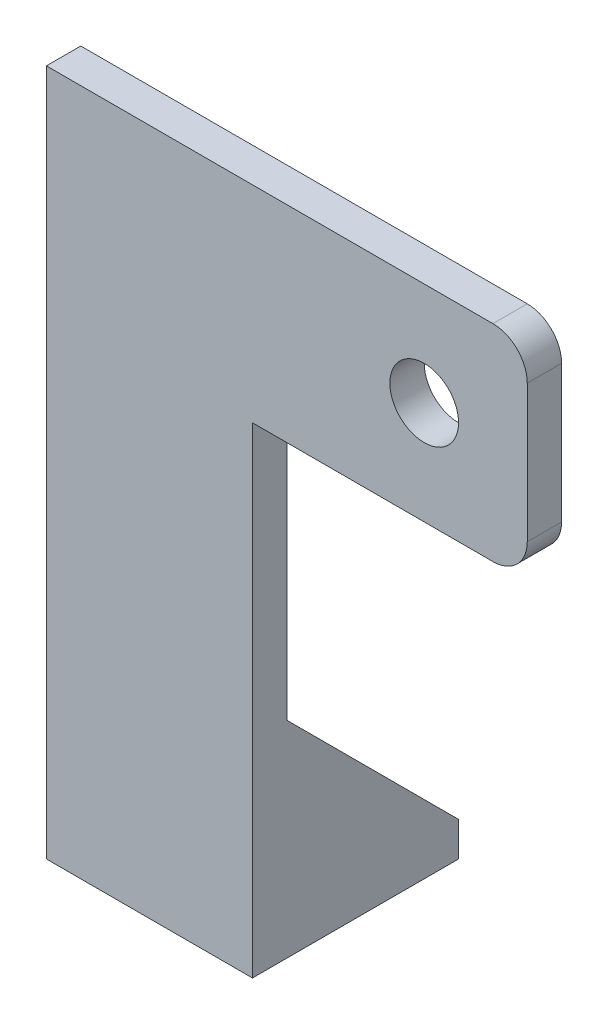
ISO-10303-21;
HEADER;
FILE_DESCRIPTION(('STEP AP214'),'2;1');
FILE_NAME('part.step','',(''),(''),'','','');
FILE_SCHEMA(('AUTOMOTIVE_DESIGN { 1 0 10303 214 1 1 1 1 }'));
ENDSEC;
DATA;
#1=APPLICATION_CONTEXT('core data for automotive mechanical design processes');
#2=APPLICATION_PROTOCOL_DEFINITION('international standard','automotive_design',2000,#1);
#3=PRODUCT_CONTEXT('',#1,'mechanical');
#4=PRODUCT('Part','Part','',(#3));
#5=PRODUCT_RELATED_PRODUCT_CATEGORY('part','',(#4));
#6=PRODUCT_DEFINITION_FORMATION('','',#4);
#7=PRODUCT_DEFINITION_CONTEXT('part definition',#1,'design');
#8=PRODUCT_DEFINITION('design','',#6,#7);
#9=PRODUCT_DEFINITION_SHAPE('','',#8);
#10=(LENGTH_UNIT() NAMED_UNIT(*) SI_UNIT(.MILLI.,.METRE.));
#11=(NAMED_UNIT(*) PLANE_ANGLE_UNIT() SI_UNIT($,.RADIAN.));
#12=(NAMED_UNIT(*) SI_UNIT($,.STERADIAN.) SOLID_ANGLE_UNIT());
#13=UNCERTAINTY_MEASURE_WITH_UNIT(LENGTH_MEASURE(1.E-05),#10,'distance_accuracy_value','');
#14=(GEOMETRIC_REPRESENTATION_CONTEXT(3) GLOBAL_UNCERTAINTY_ASSIGNED_CONTEXT((#13)) GLOBAL_UNIT_ASSIGNED_CONTEXT((#10,
#11,#12)) REPRESENTATION_CONTEXT('',''));
#15=CARTESIAN_POINT('',(0.,0.,0.));
#16=DIRECTION('',(0.,0.,1.));
#17=DIRECTION('',(1.,0.,0.));
#18=AXIS2_PLACEMENT_3D('',#15,#16,#17);
#19=CARTESIAN_POINT('',(0.,-95.,0.));
#20=DIRECTION('',(0.,-1.,0.));
#21=DIRECTION('',(0.,0.,-1.));
#22=AXIS2_PLACEMENT_3D('',#19,#20,#21);
#23=PLANE('',#22);
#24=DIRECTION('',(0.,0.,-1.));
#25=VECTOR('',#24,1.);
#26=CARTESIAN_POINT('',(45.,-95.,0.));
#27=LINE('',#26,#25);
#28=CARTESIAN_POINT('',(45.,-95.,0.));
#29=VERTEX_POINT('',#28);
#30=CARTESIAN_POINT('',(45.,-95.,-25.));
#31=VERTEX_POINT('',#30);
#32=EDGE_CURVE('E204',#29,#31,#27,.T.);
#33=ORIENTED_EDGE('',*,*,#32,.F.);
#34=DIRECTION('',(-1.,0.,0.));
#35=VECTOR('',#34,1.);
#36=CARTESIAN_POINT('',(70.,-95.,0.));
#37=LINE('',#36,#35);
#38=CARTESIAN_POINT('',(65.,-95.,0.));
#39=VERTEX_POINT('',#38);
#40=EDGE_CURVE('E143',#39,#29,#37,.T.);
#41=ORIENTED_EDGE('',*,*,#40,.F.);
#42=DIRECTION('',(0.,0.,-1.));
#43=VECTOR('',#42,1.);
#44=CARTESIAN_POINT('',(65.,-95.,0.));
#45=LINE('',#44,#43);
#46=CARTESIAN_POINT('',(65.,-95.,-25.));
#47=VERTEX_POINT('',#46);
#48=EDGE_CURVE('E198',#39,#47,#45,.T.);
#49=ORIENTED_EDGE('',*,*,#48,.T.);
#50=DIRECTION('',(1.,0.,0.));
#51=VECTOR('',#50,1.);
#52=CARTESIAN_POINT('',(40.,-95.,-25.));
#53=LINE('',#52,#51);
#54=EDGE_CURVE('E175',#31,#47,#53,.T.);
#55=ORIENTED_EDGE('',*,*,#54,.F.);
#56=EDGE_LOOP('',(#33,#41,#49,#55));
#57=FACE_BOUND('',#56,.T.);
#58=ADVANCED_FACE('F36',(#57),#23,.F.);
#59=CARTESIAN_POINT('',(5.,-5.,0.));
#60=DIRECTION('',(0.,0.,1.));
#61=DIRECTION('',(1.,0.,0.));
#62=AXIS2_PLACEMENT_3D('',#59,#60,#61);
#63=PLANE('',#62);
#64=CARTESIAN_POINT('',(95.,-15.,0.));
#65=DIRECTION('',(0.,0.,-1.));
#66=DIRECTION('',(-1.,0.,0.));
#67=AXIS2_PLACEMENT_3D('',#64,#65,#66);
#68=CIRCLE('',#67,5.);
#69=CARTESIAN_POINT('',(90.,-15.,0.));
#70=VERTEX_POINT('',#69);
#71=EDGE_CURVE('E152',#70,#70,#68,.T.);
#72=ORIENTED_EDGE('',*,*,#71,.F.);
#73=EDGE_LOOP('',(#72));
#74=FACE_BOUND('',#73,.T.);
#75=DIRECTION('',(0.,-1.,0.));
#76=VECTOR('',#75,1.);
#77=CARTESIAN_POINT('',(40.,-30.,0.));
#78=LINE('',#77,#76);
#79=CARTESIAN_POINT('',(40.,0.,0.));
#80=VERTEX_POINT('',#79);
#81=CARTESIAN_POINT('',(40.,-70.,0.));
#82=VERTEX_POINT('',#81);
#83=EDGE_CURVE('E132',#80,#82,#78,.T.);
#84=ORIENTED_EDGE('',*,*,#83,.F.);
#85=DIRECTION('',(1.,0.,0.));
#86=VECTOR('',#85,1.);
#87=CARTESIAN_POINT('',(5.,0.,0.));
#88=LINE('',#87,#86);
#89=CARTESIAN_POINT('',(105.,0.,0.));
#90=VERTEX_POINT('',#89);
#91=EDGE_CURVE('E137',#80,#90,#88,.T.);
#92=ORIENTED_EDGE('',*,*,#91,.T.);
#93=CARTESIAN_POINT('',(105.,-5.00000000000001,0.));
#94=DIRECTION('',(0.,0.,-1.));
#95=DIRECTION('',(-1.,0.,0.));
#96=AXIS2_PLACEMENT_3D('',#93,#94,#95);
#97=CIRCLE('',#96,5.);
#98=CARTESIAN_POINT('',(110.,-5.00000000000001,0.));
#99=VERTEX_POINT('',#98);
#100=EDGE_CURVE('E229',#90,#99,#97,.T.);
#101=ORIENTED_EDGE('',*,*,#100,.T.);
#102=DIRECTION('',(0.,-1.,0.));
#103=VECTOR('',#102,1.);
#104=CARTESIAN_POINT('',(110.,-5.00000000000001,0.));
#105=LINE('',#104,#103);
#106=CARTESIAN_POINT('',(110.,-25.,0.));
#107=VERTEX_POINT('',#106);
#108=EDGE_CURVE('E221',#99,#107,#105,.T.);
#109=ORIENTED_EDGE('',*,*,#108,.T.);
#110=CARTESIAN_POINT('',(105.,-25.,0.));
#111=DIRECTION('',(0.,0.,1.));
#112=DIRECTION('',(1.,0.,0.));
#113=AXIS2_PLACEMENT_3D('',#110,#111,#112);
#114=CIRCLE('',#113,5.);
#115=CARTESIAN_POINT('',(105.,-30.,0.));
#116=VERTEX_POINT('',#115);
#117=EDGE_CURVE('E225',#116,#107,#114,.T.);
#118=ORIENTED_EDGE('',*,*,#117,.F.);
#119=DIRECTION('',(-1.,0.,0.));
#120=VECTOR('',#119,1.);
#121=CARTESIAN_POINT('',(105.,-30.,0.));
#122=LINE('',#121,#120);
#123=CARTESIAN_POINT('',(70.,-30.,0.));
#124=VERTEX_POINT('',#123);
#125=EDGE_CURVE('E53',#116,#124,#122,.T.);
#126=ORIENTED_EDGE('',*,*,#125,.T.);
#127=DIRECTION('',(0.,-1.,0.));
#128=VECTOR('',#127,1.);
#129=CARTESIAN_POINT('',(70.,0.,0.));
#130=LINE('',#129,#128);
#131=CARTESIAN_POINT('',(70.,-70.,0.));
#132=VERTEX_POINT('',#131);
#133=EDGE_CURVE('E158',#124,#132,#130,.T.);
#134=ORIENTED_EDGE('',*,*,#133,.T.);
#135=DIRECTION('',(1.,0.,0.));
#136=VECTOR('',#135,1.);
#137=CARTESIAN_POINT('',(65.,-70.,0.));
#138=LINE('',#137,#136);
#139=CARTESIAN_POINT('',(65.,-70.,0.));
#140=VERTEX_POINT('',#139);
#141=EDGE_CURVE('E188',#140,#132,#138,.T.);
#142=ORIENTED_EDGE('',*,*,#141,.F.);
#143=DIRECTION('',(0.,-1.,0.));
#144=VECTOR('',#143,1.);
#145=CARTESIAN_POINT('',(65.,-70.,0.));
#146=LINE('',#145,#144);
#147=EDGE_CURVE('E195',#140,#39,#146,.T.);
#148=ORIENTED_EDGE('',*,*,#147,.T.);
#149=ORIENTED_EDGE('',*,*,#40,.T.);
#150=DIRECTION('',(0.,-1.,0.));
#151=VECTOR('',#150,1.);
#152=CARTESIAN_POINT('',(45.,-70.,0.));
#153=LINE('',#152,#151);
#154=CARTESIAN_POINT('',(45.,-70.,0.));
#155=VERTEX_POINT('',#154);
#156=EDGE_CURVE('E207',#155,#29,#153,.T.);
#157=ORIENTED_EDGE('',*,*,#156,.F.);
#158=DIRECTION('',(-1.,0.,0.));
#159=VECTOR('',#158,1.);
#160=CARTESIAN_POINT('',(45.,-70.,0.));
#161=LINE('',#160,#159);
#162=EDGE_CURVE('E140',#155,#82,#161,.T.);
#163=ORIENTED_EDGE('',*,*,#162,.T.);
#164=EDGE_LOOP('',(#84,#92,#101,#109,#118,#126,#134,#142,#148,#149,#157,#163));
#165=FACE_BOUND('',#164,.T.);
#166=ADVANCED_FACE('F134',(#74,#165),#63,.F.);
#167=CARTESIAN_POINT('',(40.,-30.,5.));
#168=DIRECTION('',(1.,0.,0.));
#169=DIRECTION('',(0.,1.,0.));
#170=AXIS2_PLACEMENT_3D('',#167,#168,#169);
#171=PLANE('',#170);
#172=DIRECTION('',(0.,0.,-1.));
#173=VECTOR('',#172,1.);
#174=CARTESIAN_POINT('',(40.,-100.,5.));
#175=LINE('',#174,#173);
#176=CARTESIAN_POINT('',(40.,-100.,5.));
#177=VERTEX_POINT('',#176);
#178=CARTESIAN_POINT('',(40.,-100.,-25.));
#179=VERTEX_POINT('',#178);
#180=EDGE_CURVE('E174',#177,#179,#175,.T.);
#181=ORIENTED_EDGE('',*,*,#180,.F.);
#182=DIRECTION('',(0.,-1.,0.));
#183=VECTOR('',#182,1.);
#184=CARTESIAN_POINT('',(40.,-30.,5.));
#185=LINE('',#184,#183);
#186=CARTESIAN_POINT('',(40.,0.,5.));
#187=VERTEX_POINT('',#186);
#188=EDGE_CURVE('E149',#187,#177,#185,.T.);
#189=ORIENTED_EDGE('',*,*,#188,.F.);
#190=DIRECTION('',(0.,0.,-1.));
#191=VECTOR('',#190,1.);
#192=CARTESIAN_POINT('',(40.,0.,5.));
#193=LINE('',#192,#191);
#194=EDGE_CURVE('E147',#187,#80,#193,.T.);
#195=ORIENTED_EDGE('',*,*,#194,.T.);
#196=ORIENTED_EDGE('',*,*,#83,.T.);
#197=DIRECTION('',(0.,0.707106781186547,0.707106781186548));
#198=VECTOR('',#197,1.);
#199=CARTESIAN_POINT('',(40.,-70.,0.));
#200=LINE('',#199,#198);
#201=CARTESIAN_POINT('',(40.,-95.,-25.));
#202=VERTEX_POINT('',#201);
#203=EDGE_CURVE('E205',#202,#82,#200,.T.);
#204=ORIENTED_EDGE('',*,*,#203,.F.);
#205=DIRECTION('',(0.,1.,0.));
#206=VECTOR('',#205,1.);
#207=CARTESIAN_POINT('',(40.,-100.,-25.));
#208=LINE('',#207,#206);
#209=EDGE_CURVE('E144',#179,#202,#208,.T.);
#210=ORIENTED_EDGE('',*,*,#209,.F.);
#211=EDGE_LOOP('',(#181,#189,#195,#196,#204,#210));
#212=FACE_BOUND('',#211,.T.);
#213=ADVANCED_FACE('F38',(#212),#171,.F.);
#214=CARTESIAN_POINT('',(70.,0.,5.));
#215=DIRECTION('',(1.,0.,0.));
#216=DIRECTION('',(0.,0.,-1.));
#217=AXIS2_PLACEMENT_3D('',#214,#215,#216);
#218=PLANE('',#217);
#219=DIRECTION('',(0.,-1.,0.));
#220=VECTOR('',#219,1.);
#221=CARTESIAN_POINT('',(70.,-30.,5.));
#222=LINE('',#221,#220);
#223=CARTESIAN_POINT('',(70.,-30.,5.));
#224=VERTEX_POINT('',#223);
#225=CARTESIAN_POINT('',(70.,-100.,5.));
#226=VERTEX_POINT('',#225);
#227=EDGE_CURVE('E45',#224,#226,#222,.T.);
#228=ORIENTED_EDGE('',*,*,#227,.T.);
#229=DIRECTION('',(0.,0.,1.));
#230=VECTOR('',#229,1.);
#231=CARTESIAN_POINT('',(70.,-100.,5.));
#232=LINE('',#231,#230);
#233=CARTESIAN_POINT('',(70.,-100.,-25.));
#234=VERTEX_POINT('',#233);
#235=EDGE_CURVE('E178',#234,#226,#232,.T.);
#236=ORIENTED_EDGE('',*,*,#235,.F.);
#237=DIRECTION('',(0.,1.,0.));
#238=VECTOR('',#237,1.);
#239=CARTESIAN_POINT('',(70.,-100.,-25.));
#240=LINE('',#239,#238);
#241=CARTESIAN_POINT('',(70.,-95.,-25.));
#242=VERTEX_POINT('',#241);
#243=EDGE_CURVE('E167',#234,#242,#240,.T.);
#244=ORIENTED_EDGE('',*,*,#243,.T.);
#245=DIRECTION('',(0.,0.707106781186547,0.707106781186548));
#246=VECTOR('',#245,1.);
#247=CARTESIAN_POINT('',(70.,-70.,0.));
#248=LINE('',#247,#246);
#249=EDGE_CURVE('E192',#242,#132,#248,.T.);
#250=ORIENTED_EDGE('',*,*,#249,.T.);
#251=ORIENTED_EDGE('',*,*,#133,.F.);
#252=DIRECTION('',(0.,0.,-1.));
#253=VECTOR('',#252,1.);
#254=CARTESIAN_POINT('',(70.,-30.,5.));
#255=LINE('',#254,#253);
#256=EDGE_CURVE('E212',#224,#124,#255,.T.);
#257=ORIENTED_EDGE('',*,*,#256,.F.);
#258=EDGE_LOOP('',(#228,#236,#244,#250,#251,#257));
#259=FACE_BOUND('',#258,.T.);
#260=ADVANCED_FACE('F259',(#259),#218,.T.);
#261=CARTESIAN_POINT('',(5.,0.,5.));
#262=DIRECTION('',(0.,1.,0.));
#263=DIRECTION('',(0.,0.,1.));
#264=AXIS2_PLACEMENT_3D('',#261,#262,#263);
#265=PLANE('',#264);
#266=ORIENTED_EDGE('',*,*,#194,.F.);
#267=DIRECTION('',(1.,0.,0.));
#268=VECTOR('',#267,1.);
#269=CARTESIAN_POINT('',(5.,0.,5.));
#270=LINE('',#269,#268);
#271=CARTESIAN_POINT('',(105.,0.,5.));
#272=VERTEX_POINT('',#271);
#273=EDGE_CURVE('E11',#187,#272,#270,.T.);
#274=ORIENTED_EDGE('',*,*,#273,.T.);
#275=DIRECTION('',(0.,0.,-1.));
#276=VECTOR('',#275,1.);
#277=CARTESIAN_POINT('',(105.,0.,5.));
#278=LINE('',#277,#276);
#279=EDGE_CURVE('E156',#272,#90,#278,.T.);
#280=ORIENTED_EDGE('',*,*,#279,.T.);
#281=ORIENTED_EDGE('',*,*,#91,.F.);
#282=EDGE_LOOP('',(#266,#274,#280,#281));
#283=FACE_BOUND('',#282,.T.);
#284=ADVANCED_FACE('F154',(#283),#265,.T.);
#285=CARTESIAN_POINT('',(5.,-5.,5.));
#286=DIRECTION('',(0.,0.,1.));
#287=DIRECTION('',(1.,0.,0.));
#288=AXIS2_PLACEMENT_3D('',#285,#286,#287);
#289=PLANE('',#288);
#290=ORIENTED_EDGE('',*,*,#273,.F.);
#291=ORIENTED_EDGE('',*,*,#188,.T.);
#292=DIRECTION('',(-1.,0.,0.));
#293=VECTOR('',#292,1.);
#294=CARTESIAN_POINT('',(40.,-100.,5.));
#295=LINE('',#294,#293);
#296=EDGE_CURVE('E170',#226,#177,#295,.T.);
#297=ORIENTED_EDGE('',*,*,#296,.F.);
#298=ORIENTED_EDGE('',*,*,#227,.F.);
#299=DIRECTION('',(-1.,0.,0.));
#300=VECTOR('',#299,1.);
#301=CARTESIAN_POINT('',(105.,-30.,5.));
#302=LINE('',#301,#300);
#303=CARTESIAN_POINT('',(105.,-30.,5.));
#304=VERTEX_POINT('',#303);
#305=EDGE_CURVE('E235',#304,#224,#302,.T.);
#306=ORIENTED_EDGE('',*,*,#305,.F.);
#307=CARTESIAN_POINT('',(105.,-25.,5.));
#308=DIRECTION('',(0.,0.,1.));
#309=DIRECTION('',(1.,0.,0.));
#310=AXIS2_PLACEMENT_3D('',#307,#308,#309);
#311=CIRCLE('',#310,5.);
#312=CARTESIAN_POINT('',(110.,-25.,5.));
#313=VERTEX_POINT('',#312);
#314=EDGE_CURVE('E233',#304,#313,#311,.T.);
#315=ORIENTED_EDGE('',*,*,#314,.T.);
#316=DIRECTION('',(0.,-1.,0.));
#317=VECTOR('',#316,1.);
#318=CARTESIAN_POINT('',(110.,-5.00000000000001,5.));
#319=LINE('',#318,#317);
#320=CARTESIAN_POINT('',(110.,-5.00000000000001,5.));
#321=VERTEX_POINT('',#320);
#322=EDGE_CURVE('E220',#321,#313,#319,.T.);
#323=ORIENTED_EDGE('',*,*,#322,.F.);
#324=CARTESIAN_POINT('',(105.,-5.00000000000001,5.));
#325=DIRECTION('',(0.,0.,-1.));
#326=DIRECTION('',(-1.,0.,0.));
#327=AXIS2_PLACEMENT_3D('',#324,#325,#326);
#328=CIRCLE('',#327,5.);
#329=EDGE_CURVE('E224',#272,#321,#328,.T.);
#330=ORIENTED_EDGE('',*,*,#329,.F.);
#331=EDGE_LOOP('',(#290,#291,#297,#298,#306,#315,#323,#330));
#332=FACE_BOUND('',#331,.T.);
#333=CARTESIAN_POINT('',(95.,-15.,5.));
#334=DIRECTION('',(0.,0.,1.));
#335=DIRECTION('',(1.,0.,0.));
#336=AXIS2_PLACEMENT_3D('',#333,#334,#335);
#337=CIRCLE('',#336,5.);
#338=CARTESIAN_POINT('',(100.,-15.,5.));
#339=VERTEX_POINT('',#338);
#340=EDGE_CURVE('E40',#339,#339,#337,.T.);
#341=ORIENTED_EDGE('',*,*,#340,.F.);
#342=EDGE_LOOP('',(#341));
#343=FACE_BOUND('',#342,.T.);
#344=ADVANCED_FACE('F247',(#332,#343),#289,.T.);
#345=CARTESIAN_POINT('',(40.,-100.,-25.));
#346=DIRECTION('',(0.,0.,1.));
#347=DIRECTION('',(1.,0.,0.));
#348=AXIS2_PLACEMENT_3D('',#345,#346,#347);
#349=PLANE('',#348);
#350=EDGE_CURVE('E171',#202,#31,#53,.T.);
#351=ORIENTED_EDGE('',*,*,#350,.T.);
#352=ORIENTED_EDGE('',*,*,#54,.T.);
#353=DIRECTION('',(1.,0.,0.));
#354=VECTOR('',#353,1.);
#355=CARTESIAN_POINT('',(65.,-95.,-25.));
#356=LINE('',#355,#354);
#357=EDGE_CURVE('E185',#47,#242,#356,.T.);
#358=ORIENTED_EDGE('',*,*,#357,.T.);
#359=ORIENTED_EDGE('',*,*,#243,.F.);
#360=DIRECTION('',(1.,0.,0.));
#361=VECTOR('',#360,1.);
#362=CARTESIAN_POINT('',(40.,-100.,-25.));
#363=LINE('',#362,#361);
#364=EDGE_CURVE('E181',#179,#234,#363,.T.);
#365=ORIENTED_EDGE('',*,*,#364,.F.);
#366=ORIENTED_EDGE('',*,*,#209,.T.);
#367=EDGE_LOOP('',(#351,#352,#358,#359,#365,#366));
#368=FACE_BOUND('',#367,.T.);
#369=ADVANCED_FACE('F249',(#368),#349,.F.);
#370=CARTESIAN_POINT('',(0.,-100.,0.));
#371=DIRECTION('',(0.,-1.,0.));
#372=DIRECTION('',(0.,0.,-1.));
#373=AXIS2_PLACEMENT_3D('',#370,#371,#372);
#374=PLANE('',#373);
#375=ORIENTED_EDGE('',*,*,#180,.T.);
#376=ORIENTED_EDGE('',*,*,#364,.T.);
#377=ORIENTED_EDGE('',*,*,#235,.T.);
#378=ORIENTED_EDGE('',*,*,#296,.T.);
#379=EDGE_LOOP('',(#375,#376,#377,#378));
#380=FACE_BOUND('',#379,.T.);
#381=ADVANCED_FACE('F256',(#380),#374,.T.);
#382=CARTESIAN_POINT('',(65.,-70.,0.));
#383=DIRECTION('',(0.,0.707106781186548,-0.707106781186547));
#384=DIRECTION('',(0.,0.707106781186547,0.707106781186548));
#385=AXIS2_PLACEMENT_3D('',#382,#383,#384);
#386=PLANE('',#385);
#387=ORIENTED_EDGE('',*,*,#249,.F.);
#388=ORIENTED_EDGE('',*,*,#357,.F.);
#389=DIRECTION('',(0.,0.707106781186547,0.707106781186548));
#390=VECTOR('',#389,1.);
#391=CARTESIAN_POINT('',(65.,-70.,0.));
#392=LINE('',#391,#390);
#393=EDGE_CURVE('E189',#47,#140,#392,.T.);
#394=ORIENTED_EDGE('',*,*,#393,.T.);
#395=ORIENTED_EDGE('',*,*,#141,.T.);
#396=EDGE_LOOP('',(#387,#388,#394,#395));
#397=FACE_BOUND('',#396,.T.);
#398=ADVANCED_FACE('F273',(#397),#386,.T.);
#399=CARTESIAN_POINT('',(65.,0.,0.));
#400=DIRECTION('',(1.,0.,0.));
#401=DIRECTION('',(0.,0.,-1.));
#402=AXIS2_PLACEMENT_3D('',#399,#400,#401);
#403=PLANE('',#402);
#404=ORIENTED_EDGE('',*,*,#147,.F.);
#405=ORIENTED_EDGE('',*,*,#393,.F.);
#406=ORIENTED_EDGE('',*,*,#48,.F.);
#407=EDGE_LOOP('',(#404,#405,#406));
#408=FACE_BOUND('',#407,.T.);
#409=ADVANCED_FACE('F277',(#408),#403,.F.);
#410=CARTESIAN_POINT('',(45.,-70.,0.));
#411=DIRECTION('',(0.,-0.707106781186548,0.707106781186547));
#412=DIRECTION('',(0.,-0.707106781186547,-0.707106781186548));
#413=AXIS2_PLACEMENT_3D('',#410,#411,#412);
#414=PLANE('',#413);
#415=ORIENTED_EDGE('',*,*,#203,.T.);
#416=ORIENTED_EDGE('',*,*,#162,.F.);
#417=DIRECTION('',(0.,0.707106781186547,0.707106781186548));
#418=VECTOR('',#417,1.);
#419=CARTESIAN_POINT('',(45.,-70.,0.));
#420=LINE('',#419,#418);
#421=EDGE_CURVE('E61',#31,#155,#420,.T.);
#422=ORIENTED_EDGE('',*,*,#421,.F.);
#423=ORIENTED_EDGE('',*,*,#350,.F.);
#424=EDGE_LOOP('',(#415,#416,#422,#423));
#425=FACE_BOUND('',#424,.T.);
#426=ADVANCED_FACE('F281',(#425),#414,.F.);
#427=CARTESIAN_POINT('',(45.,0.,0.));
#428=DIRECTION('',(-1.,0.,0.));
#429=DIRECTION('',(0.,0.,-1.));
#430=AXIS2_PLACEMENT_3D('',#427,#428,#429);
#431=PLANE('',#430);
#432=ORIENTED_EDGE('',*,*,#156,.T.);
#433=ORIENTED_EDGE('',*,*,#32,.T.);
#434=ORIENTED_EDGE('',*,*,#421,.T.);
#435=EDGE_LOOP('',(#432,#433,#434));
#436=FACE_BOUND('',#435,.T.);
#437=ADVANCED_FACE('F285',(#436),#431,.F.);
#438=CARTESIAN_POINT('',(105.,-5.00000000000001,5.));
#439=DIRECTION('',(0.,0.,-1.));
#440=DIRECTION('',(-1.,0.,0.));
#441=AXIS2_PLACEMENT_3D('',#438,#439,#440);
#442=CYLINDRICAL_SURFACE('',#441,5.);
#443=ORIENTED_EDGE('',*,*,#100,.F.);
#444=ORIENTED_EDGE('',*,*,#279,.F.);
#445=ORIENTED_EDGE('',*,*,#329,.T.);
#446=DIRECTION('',(0.,0.,-1.));
#447=VECTOR('',#446,1.);
#448=CARTESIAN_POINT('',(110.,-5.00000000000001,5.));
#449=LINE('',#448,#447);
#450=EDGE_CURVE('E218',#321,#99,#449,.T.);
#451=ORIENTED_EDGE('',*,*,#450,.T.);
#452=EDGE_LOOP('',(#443,#444,#445,#451));
#453=FACE_BOUND('',#452,.T.);
#454=ADVANCED_FACE('F288',(#453),#442,.T.);
#455=CARTESIAN_POINT('',(105.,-30.,5.));
#456=DIRECTION('',(0.,-1.,0.));
#457=DIRECTION('',(1.,0.,0.));
#458=AXIS2_PLACEMENT_3D('',#455,#456,#457);
#459=PLANE('',#458);
#460=ORIENTED_EDGE('',*,*,#125,.F.);
#461=DIRECTION('',(0.,0.,-1.));
#462=VECTOR('',#461,1.);
#463=CARTESIAN_POINT('',(105.,-30.,5.));
#464=LINE('',#463,#462);
#465=EDGE_CURVE('E214',#304,#116,#464,.T.);
#466=ORIENTED_EDGE('',*,*,#465,.F.);
#467=ORIENTED_EDGE('',*,*,#305,.T.);
#468=ORIENTED_EDGE('',*,*,#256,.T.);
#469=EDGE_LOOP('',(#460,#466,#467,#468));
#470=FACE_BOUND('',#469,.T.);
#471=ADVANCED_FACE('F292',(#470),#459,.T.);
#472=CARTESIAN_POINT('',(105.,-25.,5.));
#473=DIRECTION('',(0.,0.,-1.));
#474=DIRECTION('',(-1.,0.,0.));
#475=AXIS2_PLACEMENT_3D('',#472,#473,#474);
#476=CYLINDRICAL_SURFACE('',#475,5.);
#477=ORIENTED_EDGE('',*,*,#117,.T.);
#478=DIRECTION('',(0.,0.,-1.));
#479=VECTOR('',#478,1.);
#480=CARTESIAN_POINT('',(110.,-25.,5.));
#481=LINE('',#480,#479);
#482=EDGE_CURVE('E216',#313,#107,#481,.T.);
#483=ORIENTED_EDGE('',*,*,#482,.F.);
#484=ORIENTED_EDGE('',*,*,#314,.F.);
#485=ORIENTED_EDGE('',*,*,#465,.T.);
#486=EDGE_LOOP('',(#477,#483,#484,#485));
#487=FACE_BOUND('',#486,.T.);
#488=ADVANCED_FACE('F296',(#487),#476,.T.);
#489=CARTESIAN_POINT('',(110.,-5.00000000000001,5.));
#490=DIRECTION('',(1.,0.,0.));
#491=DIRECTION('',(0.,1.,0.));
#492=AXIS2_PLACEMENT_3D('',#489,#490,#491);
#493=PLANE('',#492);
#494=ORIENTED_EDGE('',*,*,#108,.F.);
#495=ORIENTED_EDGE('',*,*,#450,.F.);
#496=ORIENTED_EDGE('',*,*,#322,.T.);
#497=ORIENTED_EDGE('',*,*,#482,.T.);
#498=EDGE_LOOP('',(#494,#495,#496,#497));
#499=FACE_BOUND('',#498,.T.);
#500=ADVANCED_FACE('F300',(#499),#493,.T.);
#501=CARTESIAN_POINT('',(95.,-15.,10.));
#502=DIRECTION('',(0.,0.,-1.));
#503=DIRECTION('',(-1.,0.,0.));
#504=AXIS2_PLACEMENT_3D('',#501,#502,#503);
#505=CYLINDRICAL_SURFACE('',#504,5.);
#506=ORIENTED_EDGE('',*,*,#340,.T.);
#507=EDGE_LOOP('',(#506));
#508=FACE_BOUND('',#507,.T.);
#509=ORIENTED_EDGE('',*,*,#71,.T.);
#510=EDGE_LOOP('',(#509));
#511=FACE_BOUND('',#510,.T.);
#512=ADVANCED_FACE('F245',(#508,#511),#505,.F.);
#513=CLOSED_SHELL('',(#58,#166,#213,#260,#284,#344,#369,#381,#398,#409,#426,#437,#454,#471,#488,
#500,#512));
#514=MANIFOLD_SOLID_BREP('B2',#513);
#515=ADVANCED_BREP_SHAPE_REPRESENTATION('',(#18,#514),#14);
#516=SHAPE_DEFINITION_REPRESENTATION(#9,#515);
ENDSEC;
END-ISO-10303-21;
